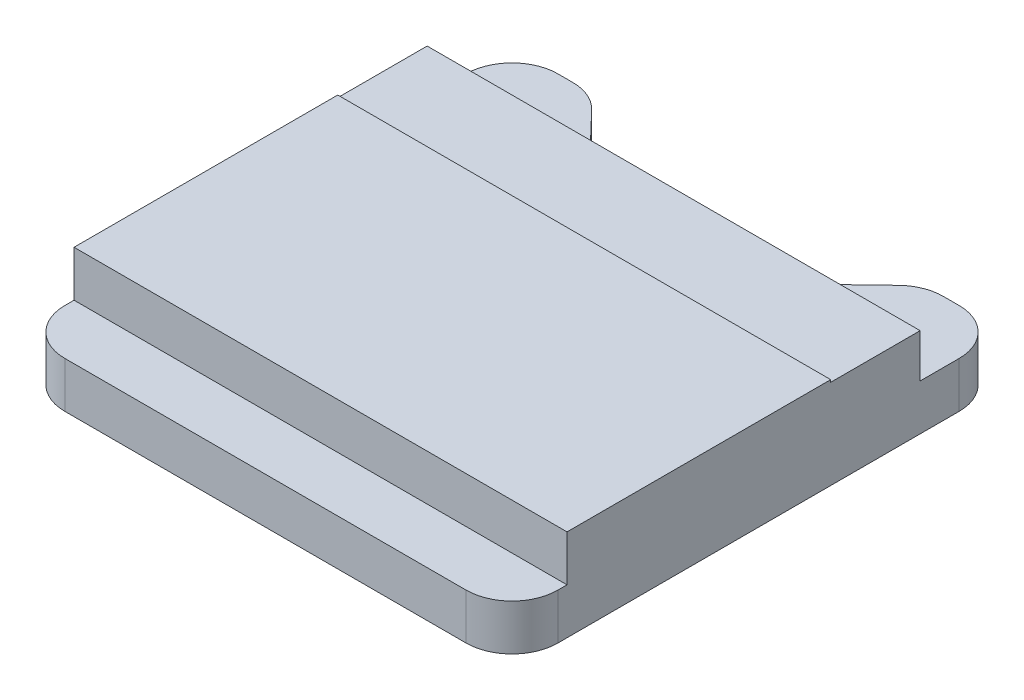
ISO-10303-21;
HEADER;
FILE_DESCRIPTION(('STEP AP214'),'2;1');
FILE_NAME('part.step','',(''),(''),'','','');
FILE_SCHEMA(('AUTOMOTIVE_DESIGN { 1 0 10303 214 1 1 1 1 }'));
ENDSEC;
DATA;
#1=APPLICATION_CONTEXT('core data for automotive mechanical design processes');
#2=APPLICATION_PROTOCOL_DEFINITION('international standard','automotive_design',2000,#1);
#3=PRODUCT_CONTEXT('',#1,'mechanical');
#4=PRODUCT('Part','Part','',(#3));
#5=PRODUCT_RELATED_PRODUCT_CATEGORY('part','',(#4));
#6=PRODUCT_DEFINITION_FORMATION('','',#4);
#7=PRODUCT_DEFINITION_CONTEXT('part definition',#1,'design');
#8=PRODUCT_DEFINITION('design','',#6,#7);
#9=PRODUCT_DEFINITION_SHAPE('','',#8);
#10=(LENGTH_UNIT() NAMED_UNIT(*) SI_UNIT(.MILLI.,.METRE.));
#11=(NAMED_UNIT(*) PLANE_ANGLE_UNIT() SI_UNIT($,.RADIAN.));
#12=(NAMED_UNIT(*) SI_UNIT($,.STERADIAN.) SOLID_ANGLE_UNIT());
#13=UNCERTAINTY_MEASURE_WITH_UNIT(LENGTH_MEASURE(1.E-05),#10,'distance_accuracy_value','');
#14=(GEOMETRIC_REPRESENTATION_CONTEXT(3) GLOBAL_UNCERTAINTY_ASSIGNED_CONTEXT((#13)) GLOBAL_UNIT_ASSIGNED_CONTEXT((#10,
#11,#12)) REPRESENTATION_CONTEXT('',''));
#15=CARTESIAN_POINT('',(0.,0.,0.));
#16=DIRECTION('',(0.,0.,1.));
#17=DIRECTION('',(1.,0.,0.));
#18=AXIS2_PLACEMENT_3D('',#15,#16,#17);
#19=CARTESIAN_POINT('',(0.,2.54,0.));
#20=DIRECTION('',(0.,1.,0.));
#21=DIRECTION('',(0.,0.,1.));
#22=AXIS2_PLACEMENT_3D('',#19,#20,#21);
#23=PLANE('',#22);
#24=DIRECTION('',(1.,0.,0.));
#25=VECTOR('',#24,1.);
#26=CARTESIAN_POINT('',(-13.6525,2.54,10.6045));
#27=LINE('',#26,#25);
#28=CARTESIAN_POINT('',(-13.6525,2.54,10.6045));
#29=VERTEX_POINT('',#28);
#30=CARTESIAN_POINT('',(13.6525,2.54,10.6045));
#31=VERTEX_POINT('',#30);
#32=EDGE_CURVE('E211',#29,#31,#27,.T.);
#33=ORIENTED_EDGE('',*,*,#32,.F.);
#34=DIRECTION('',(0.,0.,-1.));
#35=VECTOR('',#34,1.);
#36=CARTESIAN_POINT('',(-13.6525,2.54,0.));
#37=LINE('',#36,#35);
#38=CARTESIAN_POINT('',(-13.6525,2.54,11.1125));
#39=VERTEX_POINT('',#38);
#40=EDGE_CURVE('E274',#39,#29,#37,.T.);
#41=ORIENTED_EDGE('',*,*,#40,.F.);
#42=CARTESIAN_POINT('',(-11.1125,2.54,11.1125));
#43=DIRECTION('',(0.,1.,0.));
#44=DIRECTION('',(0.,0.,1.));
#45=AXIS2_PLACEMENT_3D('',#42,#43,#44);
#46=CIRCLE('',#45,2.54);
#47=CARTESIAN_POINT('',(-11.1125,2.54,13.6525));
#48=VERTEX_POINT('',#47);
#49=EDGE_CURVE('E324',#39,#48,#46,.T.);
#50=ORIENTED_EDGE('',*,*,#49,.T.);
#51=DIRECTION('',(1.,0.,0.));
#52=VECTOR('',#51,1.);
#53=CARTESIAN_POINT('',(0.,2.54,13.6525));
#54=LINE('',#53,#52);
#55=CARTESIAN_POINT('',(11.1125,2.54,13.6525));
#56=VERTEX_POINT('',#55);
#57=EDGE_CURVE('E267',#48,#56,#54,.T.);
#58=ORIENTED_EDGE('',*,*,#57,.T.);
#59=CARTESIAN_POINT('',(11.1125,2.54,11.1125));
#60=DIRECTION('',(0.,1.,0.));
#61=DIRECTION('',(0.,0.,1.));
#62=AXIS2_PLACEMENT_3D('',#59,#60,#61);
#63=CIRCLE('',#62,2.54);
#64=CARTESIAN_POINT('',(13.6525,2.54,11.1125));
#65=VERTEX_POINT('',#64);
#66=EDGE_CURVE('E322',#56,#65,#63,.T.);
#67=ORIENTED_EDGE('',*,*,#66,.T.);
#68=DIRECTION('',(0.,0.,-1.));
#69=VECTOR('',#68,1.);
#70=CARTESIAN_POINT('',(13.6525,2.54,0.));
#71=LINE('',#70,#69);
#72=EDGE_CURVE('E264',#65,#31,#71,.T.);
#73=ORIENTED_EDGE('',*,*,#72,.T.);
#74=EDGE_LOOP('',(#33,#41,#50,#58,#67,#73));
#75=FACE_BOUND('',#74,.T.);
#76=ADVANCED_FACE('F36',(#75),#23,.T.);
#77=CARTESIAN_POINT('',(-2.41044102736832,2.54,-2.5142519298954));
#78=DIRECTION('',(-0.692047464135065,0.,-0.721851998254646));
#79=DIRECTION('',(-0.721851998254646,0.,0.692047464135065));
#80=AXIS2_PLACEMENT_3D('',#77,#78,#79);
#81=PLANE('',#80);
#82=DIRECTION('',(0.721851998254646,0.,-0.692047464135065));
#83=VECTOR('',#82,1.);
#84=CARTESIAN_POINT('',(-2.41044102736832,2.54,-2.5142519298954));
#85=LINE('',#84,#83);
#86=CARTESIAN_POINT('',(6.63268441003943,2.54,-11.1839959244332));
#87=VERTEX_POINT('',#86);
#88=CARTESIAN_POINT('',(8.47057728697732,2.54,-12.9460040755668));
#89=VERTEX_POINT('',#88);
#90=EDGE_CURVE('E249',#87,#89,#85,.T.);
#91=ORIENTED_EDGE('',*,*,#90,.T.);
#92=DIRECTION('',(0.,-1.,0.));
#93=VECTOR('',#92,1.);
#94=CARTESIAN_POINT('',(8.47057728697731,2.54,-12.9460040755668));
#95=LINE('',#94,#93);
#96=CARTESIAN_POINT('',(8.47057728697732,0.,-12.9460040755668));
#97=VERTEX_POINT('',#96);
#98=EDGE_CURVE('E298',#89,#97,#95,.T.);
#99=ORIENTED_EDGE('',*,*,#98,.T.);
#100=DIRECTION('',(0.721851998254646,0.,-0.692047464135065));
#101=VECTOR('',#100,1.);
#102=CARTESIAN_POINT('',(-2.41044102736832,0.,-2.5142519298954));
#103=LINE('',#102,#101);
#104=CARTESIAN_POINT('',(6.63268441003943,0.,-11.1839959244332));
#105=VERTEX_POINT('',#104);
#106=EDGE_CURVE('E364',#105,#97,#103,.T.);
#107=ORIENTED_EDGE('',*,*,#106,.F.);
#108=DIRECTION('',(0.,-1.,0.));
#109=VECTOR('',#108,1.);
#110=CARTESIAN_POINT('',(6.63268441003943,2.54,-11.1839959244332));
#111=LINE('',#110,#109);
#112=EDGE_CURVE('E301',#105,#87,#111,.F.);
#113=ORIENTED_EDGE('',*,*,#112,.T.);
#114=EDGE_LOOP('',(#91,#99,#107,#113));
#115=FACE_BOUND('',#114,.T.);
#116=ADVANCED_FACE('F407',(#115),#81,.T.);
#117=CARTESIAN_POINT('',(0.,2.54,-10.4775));
#118=DIRECTION('',(0.,0.,-1.));
#119=DIRECTION('',(-1.,0.,0.));
#120=AXIS2_PLACEMENT_3D('',#117,#118,#119);
#121=PLANE('',#120);
#122=DIRECTION('',(1.,0.,0.));
#123=VECTOR('',#122,1.);
#124=CARTESIAN_POINT('',(0.,0.,-10.4775));
#125=LINE('',#124,#123);
#126=CARTESIAN_POINT('',(-5.07999166459369,0.,-10.4775));
#127=VERTEX_POINT('',#126);
#128=CARTESIAN_POINT('',(4.87488385113636,0.,-10.4775));
#129=VERTEX_POINT('',#128);
#130=EDGE_CURVE('E361',#127,#129,#125,.T.);
#131=ORIENTED_EDGE('',*,*,#130,.F.);
#132=DIRECTION('',(0.,-1.,0.));
#133=VECTOR('',#132,1.);
#134=CARTESIAN_POINT('',(-5.07999166459369,2.54,-10.4775));
#135=LINE('',#134,#133);
#136=CARTESIAN_POINT('',(-5.07999166459369,2.54,-10.4775));
#137=VERTEX_POINT('',#136);
#138=EDGE_CURVE('E303',#127,#137,#135,.F.);
#139=ORIENTED_EDGE('',*,*,#138,.T.);
#140=DIRECTION('',(1.,0.,0.));
#141=VECTOR('',#140,1.);
#142=CARTESIAN_POINT('',(0.,2.54,-10.4775));
#143=LINE('',#142,#141);
#144=CARTESIAN_POINT('',(4.87488385113636,2.54,-10.4775));
#145=VERTEX_POINT('',#144);
#146=EDGE_CURVE('E252',#137,#145,#143,.T.);
#147=ORIENTED_EDGE('',*,*,#146,.T.);
#148=DIRECTION('',(0.,-1.,0.));
#149=VECTOR('',#148,1.);
#150=CARTESIAN_POINT('',(4.87488385113636,0.,-10.4775));
#151=LINE('',#150,#149);
#152=EDGE_CURVE('E305',#145,#129,#151,.T.);
#153=ORIENTED_EDGE('',*,*,#152,.T.);
#154=EDGE_LOOP('',(#131,#139,#147,#153));
#155=FACE_BOUND('',#154,.T.);
#156=ADVANCED_FACE('F415',(#155),#121,.T.);
#157=CARTESIAN_POINT('',(2.02243131688779,2.54,-1.93892718676911));
#158=DIRECTION('',(0.721851998254646,0.,-0.692047464135065));
#159=DIRECTION('',(-0.692047464135065,0.,-0.721851998254646));
#160=AXIS2_PLACEMENT_3D('',#157,#158,#159);
#161=PLANE('',#160);
#162=DIRECTION('',(0.692047464135065,0.,0.721851998254646));
#163=VECTOR('',#162,1.);
#164=CARTESIAN_POINT('',(2.02243131688779,0.,-1.93892718676911));
#165=LINE('',#164,#163);
#166=CARTESIAN_POINT('',(-8.45759677750033,0.,-12.8703005589031));
#167=VERTEX_POINT('',#166);
#168=CARTESIAN_POINT('',(-6.91349574016049,0.,-11.2596994410969));
#169=VERTEX_POINT('',#168);
#170=EDGE_CURVE('E358',#167,#169,#165,.T.);
#171=ORIENTED_EDGE('',*,*,#170,.F.);
#172=DIRECTION('',(0.,-1.,0.));
#173=VECTOR('',#172,1.);
#174=CARTESIAN_POINT('',(-8.45759677750033,2.54,-12.8703005589031));
#175=LINE('',#174,#173);
#176=CARTESIAN_POINT('',(-8.45759677750033,2.54,-12.8703005589031));
#177=VERTEX_POINT('',#176);
#178=EDGE_CURVE('E308',#167,#177,#175,.F.);
#179=ORIENTED_EDGE('',*,*,#178,.T.);
#180=DIRECTION('',(0.692047464135065,0.,0.721851998254646));
#181=VECTOR('',#180,1.);
#182=CARTESIAN_POINT('',(2.02243131688779,2.54,-1.93892718676911));
#183=LINE('',#182,#181);
#184=CARTESIAN_POINT('',(-6.91349574016049,2.54,-11.2596994410969));
#185=VERTEX_POINT('',#184);
#186=EDGE_CURVE('E256',#177,#185,#183,.T.);
#187=ORIENTED_EDGE('',*,*,#186,.T.);
#188=DIRECTION('',(0.,-1.,0.));
#189=VECTOR('',#188,1.);
#190=CARTESIAN_POINT('',(-6.91349574016049,0.,-11.2596994410969));
#191=LINE('',#190,#189);
#192=EDGE_CURVE('E310',#185,#169,#191,.T.);
#193=ORIENTED_EDGE('',*,*,#192,.T.);
#194=EDGE_LOOP('',(#171,#179,#187,#193));
#195=FACE_BOUND('',#194,.T.);
#196=ADVANCED_FACE('F425',(#195),#161,.T.);
#197=CARTESIAN_POINT('',(0.,2.54,-13.6525));
#198=DIRECTION('',(0.,0.,-1.));
#199=DIRECTION('',(-1.,0.,0.));
#200=AXIS2_PLACEMENT_3D('',#197,#198,#199);
#201=PLANE('',#200);
#202=DIRECTION('',(1.,0.,0.));
#203=VECTOR('',#202,1.);
#204=CARTESIAN_POINT('',(0.,0.,-13.6525));
#205=LINE('',#204,#203);
#206=CARTESIAN_POINT('',(-11.1125,0.,-13.6525));
#207=VERTEX_POINT('',#206);
#208=CARTESIAN_POINT('',(-10.2911008530671,0.,-13.6525));
#209=VERTEX_POINT('',#208);
#210=EDGE_CURVE('E355',#207,#209,#205,.T.);
#211=ORIENTED_EDGE('',*,*,#210,.F.);
#212=DIRECTION('',(0.,-1.,0.));
#213=VECTOR('',#212,1.);
#214=CARTESIAN_POINT('',(-11.1125,2.54,-13.6525));
#215=LINE('',#214,#213);
#216=CARTESIAN_POINT('',(-11.1125,2.54,-13.6525));
#217=VERTEX_POINT('',#216);
#218=EDGE_CURVE('E326',#207,#217,#215,.F.);
#219=ORIENTED_EDGE('',*,*,#218,.T.);
#220=DIRECTION('',(1.,0.,0.));
#221=VECTOR('',#220,1.);
#222=CARTESIAN_POINT('',(0.,2.54,-13.6525));
#223=LINE('',#222,#221);
#224=CARTESIAN_POINT('',(-10.2911008530671,2.54,-13.6525));
#225=VERTEX_POINT('',#224);
#226=EDGE_CURVE('E259',#217,#225,#223,.T.);
#227=ORIENTED_EDGE('',*,*,#226,.T.);
#228=DIRECTION('',(0.,-1.,0.));
#229=VECTOR('',#228,1.);
#230=CARTESIAN_POINT('',(-10.2911008530671,2.54,-13.6525));
#231=LINE('',#230,#229);
#232=EDGE_CURVE('E328',#225,#209,#231,.T.);
#233=ORIENTED_EDGE('',*,*,#232,.T.);
#234=EDGE_LOOP('',(#211,#219,#227,#233));
#235=FACE_BOUND('',#234,.T.);
#236=ADVANCED_FACE('F434',(#235),#201,.T.);
#237=CARTESIAN_POINT('',(-13.6525,2.54,0.));
#238=DIRECTION('',(-1.,0.,0.));
#239=DIRECTION('',(0.,0.,1.));
#240=AXIS2_PLACEMENT_3D('',#237,#238,#239);
#241=PLANE('',#240);
#242=ORIENTED_EDGE('',*,*,#40,.T.);
#243=DIRECTION('',(0.,-1.,0.));
#244=VECTOR('',#243,1.);
#245=CARTESIAN_POINT('',(-13.6525,4.953,10.6045));
#246=LINE('',#245,#244);
#247=CARTESIAN_POINT('',(-13.6525,5.08,10.6045));
#248=VERTEX_POINT('',#247);
#249=EDGE_CURVE('E232',#248,#29,#246,.T.);
#250=ORIENTED_EDGE('',*,*,#249,.F.);
#251=DIRECTION('',(0.,0.,1.));
#252=VECTOR('',#251,1.);
#253=CARTESIAN_POINT('',(-13.6525,5.08,-4.00050000000001));
#254=LINE('',#253,#252);
#255=CARTESIAN_POINT('',(-13.6525,5.08,-4.00050000000001));
#256=VERTEX_POINT('',#255);
#257=EDGE_CURVE('E196',#256,#248,#254,.T.);
#258=ORIENTED_EDGE('',*,*,#257,.F.);
#259=DIRECTION('',(0.,-1.,0.));
#260=VECTOR('',#259,1.);
#261=CARTESIAN_POINT('',(-13.6525,5.08,-4.00050000000001));
#262=LINE('',#261,#260);
#263=CARTESIAN_POINT('',(-13.6525,4.953,-4.00050000000001));
#264=VERTEX_POINT('',#263);
#265=EDGE_CURVE('E192',#256,#264,#262,.T.);
#266=ORIENTED_EDGE('',*,*,#265,.T.);
#267=DIRECTION('',(0.,0.,1.));
#268=VECTOR('',#267,1.);
#269=CARTESIAN_POINT('',(-13.6525,4.953,-8.95350000000001));
#270=LINE('',#269,#268);
#271=CARTESIAN_POINT('',(-13.6525,4.953,-8.95350000000001));
#272=VERTEX_POINT('',#271);
#273=EDGE_CURVE('E219',#272,#264,#270,.T.);
#274=ORIENTED_EDGE('',*,*,#273,.F.);
#275=DIRECTION('',(0.,-1.,0.));
#276=VECTOR('',#275,1.);
#277=CARTESIAN_POINT('',(-13.6525,4.953,-8.95350000000001));
#278=LINE('',#277,#276);
#279=CARTESIAN_POINT('',(-13.6525,2.54,-8.95350000000001));
#280=VERTEX_POINT('',#279);
#281=EDGE_CURVE('E235',#272,#280,#278,.T.);
#282=ORIENTED_EDGE('',*,*,#281,.T.);
#283=CARTESIAN_POINT('',(-13.6525,2.54,-11.1125));
#284=VERTEX_POINT('',#283);
#285=EDGE_CURVE('E271',#280,#284,#37,.T.);
#286=ORIENTED_EDGE('',*,*,#285,.T.);
#287=DIRECTION('',(0.,-1.,0.));
#288=VECTOR('',#287,1.);
#289=CARTESIAN_POINT('',(-13.6525,2.54,-11.1125));
#290=LINE('',#289,#288);
#291=CARTESIAN_POINT('',(-13.6525,0.,-11.1125));
#292=VERTEX_POINT('',#291);
#293=EDGE_CURVE('E343',#284,#292,#290,.T.);
#294=ORIENTED_EDGE('',*,*,#293,.T.);
#295=DIRECTION('',(0.,0.,-1.));
#296=VECTOR('',#295,1.);
#297=CARTESIAN_POINT('',(-13.6525,0.,0.));
#298=LINE('',#297,#296);
#299=CARTESIAN_POINT('',(-13.6525,0.,11.1125));
#300=VERTEX_POINT('',#299);
#301=EDGE_CURVE('E352',#300,#292,#298,.T.);
#302=ORIENTED_EDGE('',*,*,#301,.F.);
#303=DIRECTION('',(0.,-1.,0.));
#304=VECTOR('',#303,1.);
#305=CARTESIAN_POINT('',(-13.6525,2.54,11.1125));
#306=LINE('',#305,#304);
#307=EDGE_CURVE('E263',#300,#39,#306,.F.);
#308=ORIENTED_EDGE('',*,*,#307,.T.);
#309=EDGE_LOOP('',(#242,#250,#258,#266,#274,#282,#286,#294,#302,#308));
#310=FACE_BOUND('',#309,.T.);
#311=ADVANCED_FACE('F440',(#310),#241,.T.);
#312=CARTESIAN_POINT('',(0.,2.54,13.6525));
#313=DIRECTION('',(0.,0.,-1.));
#314=DIRECTION('',(-1.,0.,0.));
#315=AXIS2_PLACEMENT_3D('',#312,#313,#314);
#316=PLANE('',#315);
#317=DIRECTION('',(1.,0.,0.));
#318=VECTOR('',#317,1.);
#319=CARTESIAN_POINT('',(0.,0.,13.6525));
#320=LINE('',#319,#318);
#321=CARTESIAN_POINT('',(-11.1125,0.,13.6525));
#322=VERTEX_POINT('',#321);
#323=CARTESIAN_POINT('',(11.1125,0.,13.6525));
#324=VERTEX_POINT('',#323);
#325=EDGE_CURVE('E349',#322,#324,#320,.T.);
#326=ORIENTED_EDGE('',*,*,#325,.T.);
#327=DIRECTION('',(0.,-1.,0.));
#328=VECTOR('',#327,1.);
#329=CARTESIAN_POINT('',(11.1125,2.54,13.6525));
#330=LINE('',#329,#328);
#331=EDGE_CURVE('E282',#324,#56,#330,.F.);
#332=ORIENTED_EDGE('',*,*,#331,.T.);
#333=ORIENTED_EDGE('',*,*,#57,.F.);
#334=DIRECTION('',(0.,-1.,0.));
#335=VECTOR('',#334,1.);
#336=CARTESIAN_POINT('',(-11.1125,0.,13.6525));
#337=LINE('',#336,#335);
#338=EDGE_CURVE('E284',#48,#322,#337,.T.);
#339=ORIENTED_EDGE('',*,*,#338,.T.);
#340=EDGE_LOOP('',(#326,#332,#333,#339));
#341=FACE_BOUND('',#340,.T.);
#342=ADVANCED_FACE('F449',(#341),#316,.F.);
#343=CARTESIAN_POINT('',(13.6525,2.54,0.));
#344=DIRECTION('',(-1.,0.,0.));
#345=DIRECTION('',(0.,0.,1.));
#346=AXIS2_PLACEMENT_3D('',#343,#344,#345);
#347=PLANE('',#346);
#348=DIRECTION('',(0.,0.,-1.));
#349=VECTOR('',#348,1.);
#350=CARTESIAN_POINT('',(13.6525,0.,0.));
#351=LINE('',#350,#349);
#352=CARTESIAN_POINT('',(13.6525,0.,11.1125));
#353=VERTEX_POINT('',#352);
#354=CARTESIAN_POINT('',(13.6525,0.,-11.1125));
#355=VERTEX_POINT('',#354);
#356=EDGE_CURVE('E347',#353,#355,#351,.T.);
#357=ORIENTED_EDGE('',*,*,#356,.T.);
#358=DIRECTION('',(0.,-1.,0.));
#359=VECTOR('',#358,1.);
#360=CARTESIAN_POINT('',(13.6525,2.54,-11.1125));
#361=LINE('',#360,#359);
#362=CARTESIAN_POINT('',(13.6525,2.54,-11.1125));
#363=VERTEX_POINT('',#362);
#364=EDGE_CURVE('E287',#355,#363,#361,.F.);
#365=ORIENTED_EDGE('',*,*,#364,.T.);
#366=CARTESIAN_POINT('',(13.6525,2.54,-8.95350000000001));
#367=VERTEX_POINT('',#366);
#368=EDGE_CURVE('E370',#367,#363,#71,.T.);
#369=ORIENTED_EDGE('',*,*,#368,.F.);
#370=DIRECTION('',(0.,-1.,0.));
#371=VECTOR('',#370,1.);
#372=CARTESIAN_POINT('',(13.6525,4.953,-8.95350000000001));
#373=LINE('',#372,#371);
#374=CARTESIAN_POINT('',(13.6525,4.953,-8.95350000000001));
#375=VERTEX_POINT('',#374);
#376=EDGE_CURVE('E366',#375,#367,#373,.T.);
#377=ORIENTED_EDGE('',*,*,#376,.F.);
#378=DIRECTION('',(0.,0.,-1.));
#379=VECTOR('',#378,1.);
#380=CARTESIAN_POINT('',(13.6525,4.953,-8.95350000000001));
#381=LINE('',#380,#379);
#382=CARTESIAN_POINT('',(13.6525,4.953,-4.00050000000001));
#383=VERTEX_POINT('',#382);
#384=EDGE_CURVE('E210',#383,#375,#381,.T.);
#385=ORIENTED_EDGE('',*,*,#384,.F.);
#386=DIRECTION('',(0.,-1.,0.));
#387=VECTOR('',#386,1.);
#388=CARTESIAN_POINT('',(13.6525,5.08,-4.00050000000001));
#389=LINE('',#388,#387);
#390=CARTESIAN_POINT('',(13.6525,5.08,-4.00050000000001));
#391=VERTEX_POINT('',#390);
#392=EDGE_CURVE('E190',#391,#383,#389,.T.);
#393=ORIENTED_EDGE('',*,*,#392,.F.);
#394=DIRECTION('',(0.,0.,-1.));
#395=VECTOR('',#394,1.);
#396=CARTESIAN_POINT('',(13.6525,5.08,-4.00050000000001));
#397=LINE('',#396,#395);
#398=CARTESIAN_POINT('',(13.6525,5.08,10.6045));
#399=VERTEX_POINT('',#398);
#400=EDGE_CURVE('E197',#399,#391,#397,.T.);
#401=ORIENTED_EDGE('',*,*,#400,.F.);
#402=DIRECTION('',(0.,-1.,0.));
#403=VECTOR('',#402,1.);
#404=CARTESIAN_POINT('',(13.6525,4.953,10.6045));
#405=LINE('',#404,#403);
#406=EDGE_CURVE('E236',#399,#31,#405,.T.);
#407=ORIENTED_EDGE('',*,*,#406,.T.);
#408=ORIENTED_EDGE('',*,*,#72,.F.);
#409=DIRECTION('',(0.,-1.,0.));
#410=VECTOR('',#409,1.);
#411=CARTESIAN_POINT('',(13.6525,2.54,11.1125));
#412=LINE('',#411,#410);
#413=EDGE_CURVE('E290',#65,#353,#412,.T.);
#414=ORIENTED_EDGE('',*,*,#413,.T.);
#415=EDGE_LOOP('',(#357,#365,#369,#377,#385,#393,#401,#407,#408,#414));
#416=FACE_BOUND('',#415,.T.);
#417=ADVANCED_FACE('F208',(#416),#347,.F.);
#418=CARTESIAN_POINT('',(10.2283778458804,0.,-13.6525));
#419=VERTEX_POINT('',#418);
#420=CARTESIAN_POINT('',(11.1125,0.,-13.6525));
#421=VERTEX_POINT('',#420);
#422=EDGE_CURVE('E253',#419,#421,#205,.T.);
#423=ORIENTED_EDGE('',*,*,#422,.F.);
#424=DIRECTION('',(0.,-1.,0.));
#425=VECTOR('',#424,1.);
#426=CARTESIAN_POINT('',(10.2283778458804,2.54,-13.6525));
#427=LINE('',#426,#425);
#428=CARTESIAN_POINT('',(10.2283778458804,2.54,-13.6525));
#429=VERTEX_POINT('',#428);
#430=EDGE_CURVE('E293',#419,#429,#427,.F.);
#431=ORIENTED_EDGE('',*,*,#430,.T.);
#432=CARTESIAN_POINT('',(11.1125,2.54,-13.6525));
#433=VERTEX_POINT('',#432);
#434=EDGE_CURVE('E260',#429,#433,#223,.T.);
#435=ORIENTED_EDGE('',*,*,#434,.T.);
#436=DIRECTION('',(0.,-1.,0.));
#437=VECTOR('',#436,1.);
#438=CARTESIAN_POINT('',(11.1125,0.,-13.6525));
#439=LINE('',#438,#437);
#440=EDGE_CURVE('E295',#433,#421,#439,.T.);
#441=ORIENTED_EDGE('',*,*,#440,.T.);
#442=EDGE_LOOP('',(#423,#431,#435,#441));
#443=FACE_BOUND('',#442,.T.);
#444=ADVANCED_FACE('F396',(#443),#201,.T.);
#445=DIRECTION('',(-1.,0.,0.));
#446=VECTOR('',#445,1.);
#447=CARTESIAN_POINT('',(-13.6525,2.54,-8.95350000000001));
#448=LINE('',#447,#446);
#449=EDGE_CURVE('E61',#367,#280,#448,.T.);
#450=ORIENTED_EDGE('',*,*,#449,.F.);
#451=ORIENTED_EDGE('',*,*,#368,.T.);
#452=CARTESIAN_POINT('',(11.1125,2.54,-11.1125));
#453=DIRECTION('',(0.,1.,0.));
#454=DIRECTION('',(0.,0.,1.));
#455=AXIS2_PLACEMENT_3D('',#452,#453,#454);
#456=CIRCLE('',#455,2.54);
#457=EDGE_CURVE('E320',#363,#433,#456,.T.);
#458=ORIENTED_EDGE('',*,*,#457,.T.);
#459=ORIENTED_EDGE('',*,*,#434,.F.);
#460=CARTESIAN_POINT('',(10.2283778458804,2.54,-11.1125));
#461=DIRECTION('',(0.,1.,0.));
#462=DIRECTION('',(0.,0.,1.));
#463=AXIS2_PLACEMENT_3D('',#460,#461,#462);
#464=CIRCLE('',#463,2.54);
#465=EDGE_CURVE('E318',#429,#89,#464,.T.);
#466=ORIENTED_EDGE('',*,*,#465,.T.);
#467=ORIENTED_EDGE('',*,*,#90,.F.);
#468=CARTESIAN_POINT('',(4.87488385113636,2.54,-13.0175));
#469=DIRECTION('',(0.,1.,0.));
#470=DIRECTION('',(0.,0.,1.));
#471=AXIS2_PLACEMENT_3D('',#468,#469,#470);
#472=CIRCLE('',#471,2.54);
#473=EDGE_CURVE('E11',#87,#145,#472,.F.);
#474=ORIENTED_EDGE('',*,*,#473,.T.);
#475=ORIENTED_EDGE('',*,*,#146,.F.);
#476=CARTESIAN_POINT('',(-5.07999166459369,2.54,-13.0175));
#477=DIRECTION('',(0.,1.,0.));
#478=DIRECTION('',(0.,0.,1.));
#479=AXIS2_PLACEMENT_3D('',#476,#477,#478);
#480=CIRCLE('',#479,2.54);
#481=EDGE_CURVE('E278',#137,#185,#480,.F.);
#482=ORIENTED_EDGE('',*,*,#481,.T.);
#483=ORIENTED_EDGE('',*,*,#186,.F.);
#484=CARTESIAN_POINT('',(-10.2911008530671,2.54,-11.1125));
#485=DIRECTION('',(0.,1.,0.));
#486=DIRECTION('',(0.,0.,1.));
#487=AXIS2_PLACEMENT_3D('',#484,#485,#486);
#488=CIRCLE('',#487,2.54);
#489=EDGE_CURVE('E316',#177,#225,#488,.T.);
#490=ORIENTED_EDGE('',*,*,#489,.T.);
#491=ORIENTED_EDGE('',*,*,#226,.F.);
#492=CARTESIAN_POINT('',(-11.1125,2.54,-11.1125));
#493=DIRECTION('',(0.,1.,0.));
#494=DIRECTION('',(0.,0.,1.));
#495=AXIS2_PLACEMENT_3D('',#492,#493,#494);
#496=CIRCLE('',#495,2.54);
#497=EDGE_CURVE('E313',#217,#284,#496,.T.);
#498=ORIENTED_EDGE('',*,*,#497,.T.);
#499=ORIENTED_EDGE('',*,*,#285,.F.);
#500=EDGE_LOOP('',(#450,#451,#458,#459,#466,#467,#474,#475,#482,#483,#490,#491,#498,#499));
#501=FACE_BOUND('',#500,.T.);
#502=ADVANCED_FACE('F400',(#501),#23,.T.);
#503=CARTESIAN_POINT('',(0.,0.,0.));
#504=DIRECTION('',(0.,1.,0.));
#505=DIRECTION('',(0.,0.,1.));
#506=AXIS2_PLACEMENT_3D('',#503,#504,#505);
#507=PLANE('',#506);
#508=ORIENTED_EDGE('',*,*,#301,.T.);
#509=CARTESIAN_POINT('',(-11.1125,0.,-11.1125));
#510=DIRECTION('',(0.,1.,0.));
#511=DIRECTION('',(0.,0.,1.));
#512=AXIS2_PLACEMENT_3D('',#509,#510,#511);
#513=CIRCLE('',#512,2.54);
#514=EDGE_CURVE('E331',#292,#207,#513,.F.);
#515=ORIENTED_EDGE('',*,*,#514,.T.);
#516=ORIENTED_EDGE('',*,*,#210,.T.);
#517=CARTESIAN_POINT('',(-10.2911008530671,0.,-11.1125));
#518=DIRECTION('',(0.,1.,0.));
#519=DIRECTION('',(0.,0.,1.));
#520=AXIS2_PLACEMENT_3D('',#517,#518,#519);
#521=CIRCLE('',#520,2.54);
#522=EDGE_CURVE('E333',#209,#167,#521,.F.);
#523=ORIENTED_EDGE('',*,*,#522,.T.);
#524=ORIENTED_EDGE('',*,*,#170,.T.);
#525=CARTESIAN_POINT('',(-5.07999166459369,0.,-13.0175));
#526=DIRECTION('',(0.,1.,0.));
#527=DIRECTION('',(0.,0.,1.));
#528=AXIS2_PLACEMENT_3D('',#525,#526,#527);
#529=CIRCLE('',#528,2.54);
#530=EDGE_CURVE('E280',#169,#127,#529,.T.);
#531=ORIENTED_EDGE('',*,*,#530,.T.);
#532=ORIENTED_EDGE('',*,*,#130,.T.);
#533=CARTESIAN_POINT('',(4.87488385113636,0.,-13.0175));
#534=DIRECTION('',(0.,1.,0.));
#535=DIRECTION('',(0.,0.,1.));
#536=AXIS2_PLACEMENT_3D('',#533,#534,#535);
#537=CIRCLE('',#536,2.54);
#538=EDGE_CURVE('E45',#129,#105,#537,.T.);
#539=ORIENTED_EDGE('',*,*,#538,.T.);
#540=ORIENTED_EDGE('',*,*,#106,.T.);
#541=CARTESIAN_POINT('',(10.2283778458804,0.,-11.1125));
#542=DIRECTION('',(0.,1.,0.));
#543=DIRECTION('',(0.,0.,1.));
#544=AXIS2_PLACEMENT_3D('',#541,#542,#543);
#545=CIRCLE('',#544,2.54);
#546=EDGE_CURVE('E335',#97,#419,#545,.F.);
#547=ORIENTED_EDGE('',*,*,#546,.T.);
#548=ORIENTED_EDGE('',*,*,#422,.T.);
#549=CARTESIAN_POINT('',(11.1125,0.,-11.1125));
#550=DIRECTION('',(0.,1.,0.));
#551=DIRECTION('',(0.,0.,1.));
#552=AXIS2_PLACEMENT_3D('',#549,#550,#551);
#553=CIRCLE('',#552,2.54);
#554=EDGE_CURVE('E337',#421,#355,#553,.F.);
#555=ORIENTED_EDGE('',*,*,#554,.T.);
#556=ORIENTED_EDGE('',*,*,#356,.F.);
#557=CARTESIAN_POINT('',(11.1125,0.,11.1125));
#558=DIRECTION('',(0.,1.,0.));
#559=DIRECTION('',(0.,0.,1.));
#560=AXIS2_PLACEMENT_3D('',#557,#558,#559);
#561=CIRCLE('',#560,2.54);
#562=EDGE_CURVE('E339',#353,#324,#561,.F.);
#563=ORIENTED_EDGE('',*,*,#562,.T.);
#564=ORIENTED_EDGE('',*,*,#325,.F.);
#565=CARTESIAN_POINT('',(-11.1125,0.,11.1125));
#566=DIRECTION('',(0.,1.,0.));
#567=DIRECTION('',(0.,0.,1.));
#568=AXIS2_PLACEMENT_3D('',#565,#566,#567);
#569=CIRCLE('',#568,2.54);
#570=EDGE_CURVE('E341',#322,#300,#569,.F.);
#571=ORIENTED_EDGE('',*,*,#570,.T.);
#572=EDGE_LOOP('',(#508,#515,#516,#523,#524,#531,#532,#539,#540,#547,#548,#555,#556,#563,#564,#571));
#573=FACE_BOUND('',#572,.T.);
#574=ADVANCED_FACE('F387',(#573),#507,.F.);
#575=CARTESIAN_POINT('',(-11.1125,2.54,-11.1125));
#576=DIRECTION('',(0.,-1.,0.));
#577=DIRECTION('',(0.,0.,-1.));
#578=AXIS2_PLACEMENT_3D('',#575,#576,#577);
#579=CYLINDRICAL_SURFACE('',#578,2.54);
#580=ORIENTED_EDGE('',*,*,#497,.F.);
#581=ORIENTED_EDGE('',*,*,#218,.F.);
#582=ORIENTED_EDGE('',*,*,#514,.F.);
#583=ORIENTED_EDGE('',*,*,#293,.F.);
#584=EDGE_LOOP('',(#580,#581,#582,#583));
#585=FACE_BOUND('',#584,.T.);
#586=ADVANCED_FACE('F446',(#585),#579,.T.);
#587=CARTESIAN_POINT('',(-10.2911008530671,2.54,-11.1125));
#588=DIRECTION('',(0.,-1.,0.));
#589=DIRECTION('',(0.,0.,-1.));
#590=AXIS2_PLACEMENT_3D('',#587,#588,#589);
#591=CYLINDRICAL_SURFACE('',#590,2.54);
#592=ORIENTED_EDGE('',*,*,#489,.F.);
#593=ORIENTED_EDGE('',*,*,#178,.F.);
#594=ORIENTED_EDGE('',*,*,#522,.F.);
#595=ORIENTED_EDGE('',*,*,#232,.F.);
#596=EDGE_LOOP('',(#592,#593,#594,#595));
#597=FACE_BOUND('',#596,.T.);
#598=ADVANCED_FACE('F431',(#597),#591,.T.);
#599=CARTESIAN_POINT('',(-5.07999166459369,2.54,-13.0175));
#600=DIRECTION('',(0.,1.,0.));
#601=DIRECTION('',(0.,0.,1.));
#602=AXIS2_PLACEMENT_3D('',#599,#600,#601);
#603=CYLINDRICAL_SURFACE('',#602,2.54);
#604=ORIENTED_EDGE('',*,*,#481,.F.);
#605=ORIENTED_EDGE('',*,*,#138,.F.);
#606=ORIENTED_EDGE('',*,*,#530,.F.);
#607=ORIENTED_EDGE('',*,*,#192,.F.);
#608=EDGE_LOOP('',(#604,#605,#606,#607));
#609=FACE_BOUND('',#608,.T.);
#610=ADVANCED_FACE('F422',(#609),#603,.F.);
#611=CARTESIAN_POINT('',(10.2283778458804,2.54,-11.1125));
#612=DIRECTION('',(0.,-1.,0.));
#613=DIRECTION('',(0.,0.,-1.));
#614=AXIS2_PLACEMENT_3D('',#611,#612,#613);
#615=CYLINDRICAL_SURFACE('',#614,2.54);
#616=ORIENTED_EDGE('',*,*,#465,.F.);
#617=ORIENTED_EDGE('',*,*,#430,.F.);
#618=ORIENTED_EDGE('',*,*,#546,.F.);
#619=ORIENTED_EDGE('',*,*,#98,.F.);
#620=EDGE_LOOP('',(#616,#617,#618,#619));
#621=FACE_BOUND('',#620,.T.);
#622=ADVANCED_FACE('F404',(#621),#615,.T.);
#623=CARTESIAN_POINT('',(4.87488385113636,2.54,-13.0175));
#624=DIRECTION('',(0.,1.,0.));
#625=DIRECTION('',(0.,0.,1.));
#626=AXIS2_PLACEMENT_3D('',#623,#624,#625);
#627=CYLINDRICAL_SURFACE('',#626,2.54);
#628=ORIENTED_EDGE('',*,*,#473,.F.);
#629=ORIENTED_EDGE('',*,*,#112,.F.);
#630=ORIENTED_EDGE('',*,*,#538,.F.);
#631=ORIENTED_EDGE('',*,*,#152,.F.);
#632=EDGE_LOOP('',(#628,#629,#630,#631));
#633=FACE_BOUND('',#632,.T.);
#634=ADVANCED_FACE('F413',(#633),#627,.F.);
#635=CARTESIAN_POINT('',(11.1125,2.54,-11.1125));
#636=DIRECTION('',(0.,1.,0.));
#637=DIRECTION('',(0.,0.,1.));
#638=AXIS2_PLACEMENT_3D('',#635,#636,#637);
#639=CYLINDRICAL_SURFACE('',#638,2.54);
#640=ORIENTED_EDGE('',*,*,#457,.F.);
#641=ORIENTED_EDGE('',*,*,#364,.F.);
#642=ORIENTED_EDGE('',*,*,#554,.F.);
#643=ORIENTED_EDGE('',*,*,#440,.F.);
#644=EDGE_LOOP('',(#640,#641,#642,#643));
#645=FACE_BOUND('',#644,.T.);
#646=ADVANCED_FACE('F394',(#645),#639,.T.);
#647=CARTESIAN_POINT('',(11.1125,2.54,11.1125));
#648=DIRECTION('',(0.,-1.,0.));
#649=DIRECTION('',(0.,0.,-1.));
#650=AXIS2_PLACEMENT_3D('',#647,#648,#649);
#651=CYLINDRICAL_SURFACE('',#650,2.54);
#652=ORIENTED_EDGE('',*,*,#66,.F.);
#653=ORIENTED_EDGE('',*,*,#331,.F.);
#654=ORIENTED_EDGE('',*,*,#562,.F.);
#655=ORIENTED_EDGE('',*,*,#413,.F.);
#656=EDGE_LOOP('',(#652,#653,#654,#655));
#657=FACE_BOUND('',#656,.T.);
#658=ADVANCED_FACE('F383',(#657),#651,.T.);
#659=CARTESIAN_POINT('',(-11.1125,2.54,11.1125));
#660=DIRECTION('',(0.,1.,0.));
#661=DIRECTION('',(0.,0.,1.));
#662=AXIS2_PLACEMENT_3D('',#659,#660,#661);
#663=CYLINDRICAL_SURFACE('',#662,2.54);
#664=ORIENTED_EDGE('',*,*,#49,.F.);
#665=ORIENTED_EDGE('',*,*,#307,.F.);
#666=ORIENTED_EDGE('',*,*,#570,.F.);
#667=ORIENTED_EDGE('',*,*,#338,.F.);
#668=EDGE_LOOP('',(#664,#665,#666,#667));
#669=FACE_BOUND('',#668,.T.);
#670=ADVANCED_FACE('F38',(#669),#663,.T.);
#671=CARTESIAN_POINT('',(-13.6525,4.953,-8.95350000000001));
#672=DIRECTION('',(0.,0.,1.));
#673=DIRECTION('',(1.,0.,0.));
#674=AXIS2_PLACEMENT_3D('',#671,#672,#673);
#675=PLANE('',#674);
#676=ORIENTED_EDGE('',*,*,#449,.T.);
#677=ORIENTED_EDGE('',*,*,#281,.F.);
#678=DIRECTION('',(-1.,0.,0.));
#679=VECTOR('',#678,1.);
#680=CARTESIAN_POINT('',(-13.6525,4.953,-8.95350000000001));
#681=LINE('',#680,#679);
#682=EDGE_CURVE('E228',#375,#272,#681,.T.);
#683=ORIENTED_EDGE('',*,*,#682,.F.);
#684=ORIENTED_EDGE('',*,*,#376,.T.);
#685=EDGE_LOOP('',(#676,#677,#683,#684));
#686=FACE_BOUND('',#685,.T.);
#687=ADVANCED_FACE('F499',(#686),#675,.F.);
#688=CARTESIAN_POINT('',(-13.6525,4.953,10.6045));
#689=DIRECTION('',(0.,0.,-1.));
#690=DIRECTION('',(-1.,0.,0.));
#691=AXIS2_PLACEMENT_3D('',#688,#689,#690);
#692=PLANE('',#691);
#693=ORIENTED_EDGE('',*,*,#32,.T.);
#694=ORIENTED_EDGE('',*,*,#406,.F.);
#695=DIRECTION('',(1.,0.,0.));
#696=VECTOR('',#695,1.);
#697=CARTESIAN_POINT('',(-13.6525,5.08,10.6045));
#698=LINE('',#697,#696);
#699=EDGE_CURVE('E203',#248,#399,#698,.T.);
#700=ORIENTED_EDGE('',*,*,#699,.F.);
#701=ORIENTED_EDGE('',*,*,#249,.T.);
#702=EDGE_LOOP('',(#693,#694,#700,#701));
#703=FACE_BOUND('',#702,.T.);
#704=ADVANCED_FACE('F503',(#703),#692,.F.);
#705=CARTESIAN_POINT('',(0.,4.953,0.));
#706=DIRECTION('',(0.,1.,0.));
#707=DIRECTION('',(0.,0.,1.));
#708=AXIS2_PLACEMENT_3D('',#705,#706,#707);
#709=PLANE('',#708);
#710=DIRECTION('',(-1.,0.,0.));
#711=VECTOR('',#710,1.);
#712=CARTESIAN_POINT('',(-13.6525,4.953,-4.00050000000001));
#713=LINE('',#712,#711);
#714=EDGE_CURVE('E53',#383,#264,#713,.T.);
#715=ORIENTED_EDGE('',*,*,#714,.F.);
#716=ORIENTED_EDGE('',*,*,#384,.T.);
#717=ORIENTED_EDGE('',*,*,#682,.T.);
#718=ORIENTED_EDGE('',*,*,#273,.T.);
#719=EDGE_LOOP('',(#715,#716,#717,#718));
#720=FACE_BOUND('',#719,.T.);
#721=ADVANCED_FACE('F508',(#720),#709,.T.);
#722=CARTESIAN_POINT('',(-13.6525,5.08,-4.00050000000001));
#723=DIRECTION('',(0.,0.,1.));
#724=DIRECTION('',(1.,0.,0.));
#725=AXIS2_PLACEMENT_3D('',#722,#723,#724);
#726=PLANE('',#725);
#727=ORIENTED_EDGE('',*,*,#714,.T.);
#728=ORIENTED_EDGE('',*,*,#265,.F.);
#729=DIRECTION('',(-1.,0.,0.));
#730=VECTOR('',#729,1.);
#731=CARTESIAN_POINT('',(-13.6525,5.08,-4.00050000000001));
#732=LINE('',#731,#730);
#733=EDGE_CURVE('E186',#391,#256,#732,.T.);
#734=ORIENTED_EDGE('',*,*,#733,.F.);
#735=ORIENTED_EDGE('',*,*,#392,.T.);
#736=EDGE_LOOP('',(#727,#728,#734,#735));
#737=FACE_BOUND('',#736,.T.);
#738=ADVANCED_FACE('F188',(#737),#726,.F.);
#739=CARTESIAN_POINT('',(0.,5.08,0.));
#740=DIRECTION('',(0.,1.,0.));
#741=DIRECTION('',(0.,0.,1.));
#742=AXIS2_PLACEMENT_3D('',#739,#740,#741);
#743=PLANE('',#742);
#744=ORIENTED_EDGE('',*,*,#400,.T.);
#745=ORIENTED_EDGE('',*,*,#733,.T.);
#746=ORIENTED_EDGE('',*,*,#257,.T.);
#747=ORIENTED_EDGE('',*,*,#699,.T.);
#748=EDGE_LOOP('',(#744,#745,#746,#747));
#749=FACE_BOUND('',#748,.T.);
#750=ADVANCED_FACE('F201',(#749),#743,.T.);
#751=CLOSED_SHELL('',(#76,#116,#156,#196,#236,#311,#342,#417,#444,#502,#574,#586,#598,#610,#622,
#634,#646,#658,#670,#687,#704,#721,#738,#750));
#752=MANIFOLD_SOLID_BREP('B2',#751);
#753=ADVANCED_BREP_SHAPE_REPRESENTATION('',(#18,#752),#14);
#754=SHAPE_DEFINITION_REPRESENTATION(#9,#753);
ENDSEC;
END-ISO-10303-21;
